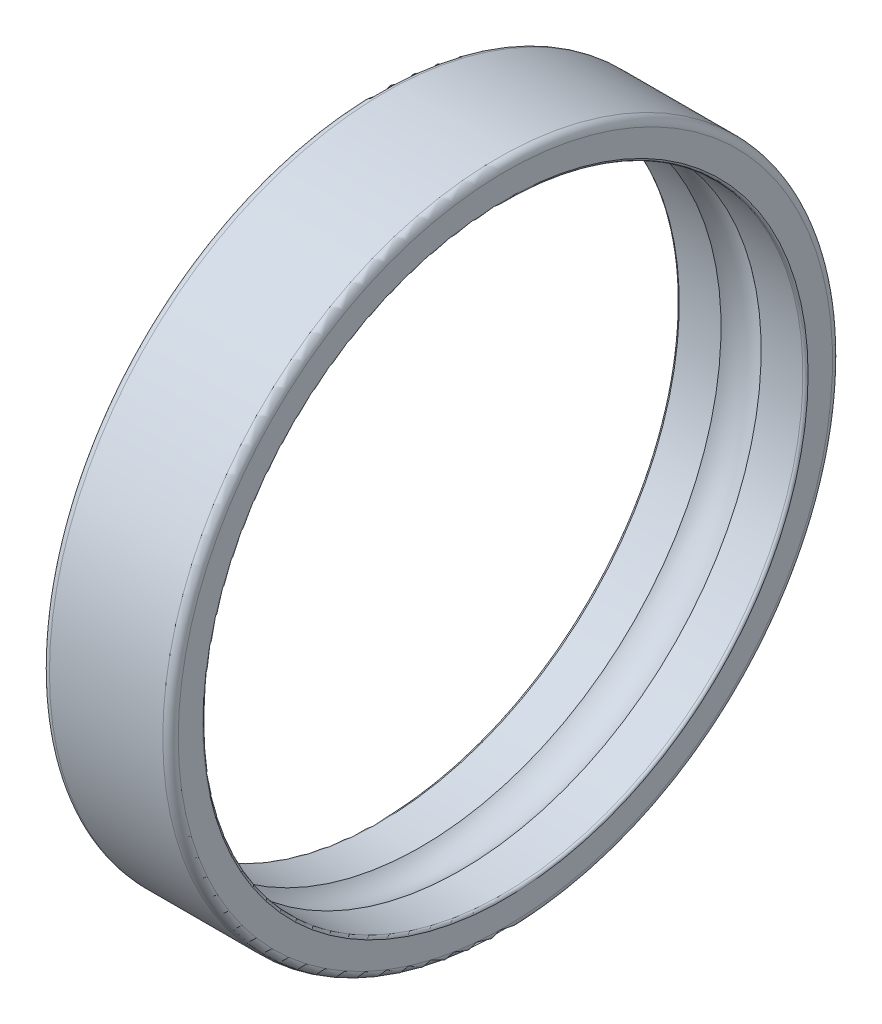
ISO-10303-21;
HEADER;
FILE_DESCRIPTION(('STEP AP214'),'2;1');
FILE_NAME('part.step','',(''),(''),'','','');
FILE_SCHEMA(('AUTOMOTIVE_DESIGN { 1 0 10303 214 1 1 1 1 }'));
ENDSEC;
DATA;
#1=APPLICATION_CONTEXT('core data for automotive mechanical design processes');
#2=APPLICATION_PROTOCOL_DEFINITION('international standard','automotive_design',2000,#1);
#3=PRODUCT_CONTEXT('',#1,'mechanical');
#4=PRODUCT('Part','Part','',(#3));
#5=PRODUCT_RELATED_PRODUCT_CATEGORY('part','',(#4));
#6=PRODUCT_DEFINITION_FORMATION('','',#4);
#7=PRODUCT_DEFINITION_CONTEXT('part definition',#1,'design');
#8=PRODUCT_DEFINITION('design','',#6,#7);
#9=PRODUCT_DEFINITION_SHAPE('','',#8);
#10=(LENGTH_UNIT() NAMED_UNIT(*) SI_UNIT(.MILLI.,.METRE.));
#11=(NAMED_UNIT(*) PLANE_ANGLE_UNIT() SI_UNIT($,.RADIAN.));
#12=(NAMED_UNIT(*) SI_UNIT($,.STERADIAN.) SOLID_ANGLE_UNIT());
#13=UNCERTAINTY_MEASURE_WITH_UNIT(LENGTH_MEASURE(1.E-05),#10,'distance_accuracy_value','');
#14=(GEOMETRIC_REPRESENTATION_CONTEXT(3) GLOBAL_UNCERTAINTY_ASSIGNED_CONTEXT((#13)) GLOBAL_UNIT_ASSIGNED_CONTEXT((#10,
#11,#12)) REPRESENTATION_CONTEXT('',''));
#15=CARTESIAN_POINT('',(0.,0.,0.));
#16=DIRECTION('',(0.,0.,1.));
#17=DIRECTION('',(1.,0.,0.));
#18=AXIS2_PLACEMENT_3D('',#15,#16,#17);
#19=CARTESIAN_POINT('',(0.,-12.9359195655334,-12.7));
#20=DIRECTION('',(-1.,0.,0.));
#21=DIRECTION('',(0.,0.,1.));
#22=AXIS2_PLACEMENT_3D('',#19,#20,#21);
#23=PLANE('',#22);
#24=CARTESIAN_POINT('',(0.,0.,0.));
#25=DIRECTION('',(-1.,0.,0.));
#26=DIRECTION('',(0.,0.,-1.));
#27=AXIS2_PLACEMENT_3D('',#24,#25,#26);
#28=CIRCLE('',#27,12.7);
#29=CARTESIAN_POINT('',(0.,0.,-12.7));
#30=VERTEX_POINT('',#29);
#31=EDGE_CURVE('E50',#30,#30,#28,.F.);
#32=ORIENTED_EDGE('',*,*,#31,.F.);
#33=EDGE_LOOP('',(#32));
#34=FACE_BOUND('',#33,.T.);
#35=CARTESIAN_POINT('',(0.,0.,0.));
#36=DIRECTION('',(1.,0.,0.));
#37=DIRECTION('',(0.,0.,1.));
#38=AXIS2_PLACEMENT_3D('',#35,#36,#37);
#39=CIRCLE('',#38,11.7499999999994);
#40=CARTESIAN_POINT('',(0.,0.,11.7499999999994));
#41=VERTEX_POINT('',#40);
#42=EDGE_CURVE('E47',#41,#41,#39,.T.);
#43=ORIENTED_EDGE('',*,*,#42,.T.);
#44=EDGE_LOOP('',(#43));
#45=FACE_BOUND('',#44,.T.);
#46=ADVANCED_FACE('F15',(#34,#45),#23,.T.);
#47=CARTESIAN_POINT('',(5.,-12.9359195434397,12.7));
#48=DIRECTION('',(1.,0.,0.));
#49=DIRECTION('',(0.,0.,-1.));
#50=AXIS2_PLACEMENT_3D('',#47,#48,#49);
#51=PLANE('',#50);
#52=CARTESIAN_POINT('',(5.,0.,0.));
#53=DIRECTION('',(1.,0.,0.));
#54=DIRECTION('',(0.,-1.16841773351946E-09,1.));
#55=AXIS2_PLACEMENT_3D('',#52,#53,#54);
#56=CIRCLE('',#55,12.7);
#57=CARTESIAN_POINT('',(5.,-1.48389052156972E-08,12.7));
#58=VERTEX_POINT('',#57);
#59=EDGE_CURVE('E44',#58,#58,#56,.T.);
#60=ORIENTED_EDGE('',*,*,#59,.T.);
#61=EDGE_LOOP('',(#60));
#62=FACE_BOUND('',#61,.T.);
#63=CARTESIAN_POINT('',(5.,0.,0.));
#64=DIRECTION('',(-1.,0.,0.));
#65=DIRECTION('',(0.,0.,-1.));
#66=AXIS2_PLACEMENT_3D('',#63,#64,#65);
#67=CIRCLE('',#66,11.7500000258519);
#68=CARTESIAN_POINT('',(5.,0.,-11.7500000258519));
#69=VERTEX_POINT('',#68);
#70=EDGE_CURVE('E41',#69,#69,#67,.F.);
#71=ORIENTED_EDGE('',*,*,#70,.F.);
#72=EDGE_LOOP('',(#71));
#73=FACE_BOUND('',#72,.T.);
#74=ADVANCED_FACE('F59',(#62,#73),#51,.T.);
#75=CARTESIAN_POINT('',(0.29999999999994,0.,0.));
#76=DIRECTION('',(1.,0.,0.));
#77=DIRECTION('',(0.,1.92328053823384E-10,1.));
#78=AXIS2_PLACEMENT_3D('',#75,#76,#77);
#79=TOROIDAL_SURFACE('',#78,12.7,0.299999999999939);
#80=ORIENTED_EDGE('',*,*,#31,.T.);
#81=EDGE_LOOP('',(#80));
#82=FACE_BOUND('',#81,.T.);
#83=CARTESIAN_POINT('',(0.29999999999994,0.,0.));
#84=DIRECTION('',(-1.,0.,0.));
#85=DIRECTION('',(0.,0.,-1.));
#86=AXIS2_PLACEMENT_3D('',#83,#84,#85);
#87=CIRCLE('',#86,12.9999999999999);
#88=CARTESIAN_POINT('',(0.29999999999994,0.,-12.9999999999999));
#89=VERTEX_POINT('',#88);
#90=EDGE_CURVE('E38',#89,#89,#87,.F.);
#91=ORIENTED_EDGE('',*,*,#90,.F.);
#92=EDGE_LOOP('',(#91));
#93=FACE_BOUND('',#92,.T.);
#94=ADVANCED_FACE('F54',(#82,#93),#79,.T.);
#95=CARTESIAN_POINT('',(0.099999999999411,0.,0.));
#96=DIRECTION('',(1.,0.,0.));
#97=DIRECTION('',(0.,0.,1.));
#98=AXIS2_PLACEMENT_3D('',#95,#96,#97);
#99=TOROIDAL_SURFACE('',#98,11.7499999999994,0.099999999999411);
#100=CARTESIAN_POINT('',(0.100000000000003,0.,0.));
#101=DIRECTION('',(1.,0.,0.));
#102=DIRECTION('',(0.,0.,1.));
#103=AXIS2_PLACEMENT_3D('',#100,#101,#102);
#104=CIRCLE('',#103,11.65);
#105=CARTESIAN_POINT('',(0.100000000000003,0.,11.65));
#106=VERTEX_POINT('',#105);
#107=EDGE_CURVE('E35',#106,#106,#104,.T.);
#108=ORIENTED_EDGE('',*,*,#107,.T.);
#109=EDGE_LOOP('',(#108));
#110=FACE_BOUND('',#109,.T.);
#111=ORIENTED_EDGE('',*,*,#42,.F.);
#112=EDGE_LOOP('',(#111));
#113=FACE_BOUND('',#112,.T.);
#114=ADVANCED_FACE('F63',(#110,#113),#99,.T.);
#115=CARTESIAN_POINT('',(50.,0.,0.));
#116=DIRECTION('',(1.,0.,0.));
#117=DIRECTION('',(0.,0.,1.));
#118=AXIS2_PLACEMENT_3D('',#115,#116,#117);
#119=CYLINDRICAL_SURFACE('',#118,11.65);
#120=CARTESIAN_POINT('',(1.7207117028981,0.,0.));
#121=DIRECTION('',(1.,0.,0.));
#122=DIRECTION('',(0.,0.,1.));
#123=AXIS2_PLACEMENT_3D('',#120,#121,#122);
#124=CIRCLE('',#123,11.65);
#125=CARTESIAN_POINT('',(1.7207117028981,0.,11.65));
#126=VERTEX_POINT('',#125);
#127=EDGE_CURVE('E30',#126,#126,#124,.T.);
#128=ORIENTED_EDGE('',*,*,#127,.T.);
#129=EDGE_LOOP('',(#128));
#130=FACE_BOUND('',#129,.T.);
#131=ORIENTED_EDGE('',*,*,#107,.F.);
#132=EDGE_LOOP('',(#131));
#133=FACE_BOUND('',#132,.T.);
#134=ADVANCED_FACE('F65',(#130,#133),#119,.F.);
#135=CARTESIAN_POINT('',(2.5,0.,0.));
#136=DIRECTION('',(1.,0.,0.));
#137=DIRECTION('',(0.,0.,1.));
#138=AXIS2_PLACEMENT_3D('',#135,#136,#137);
#139=TOROIDAL_SURFACE('',#138,10.75,1.19049999999997);
#140=ORIENTED_EDGE('',*,*,#127,.F.);
#141=EDGE_LOOP('',(#140));
#142=FACE_BOUND('',#141,.T.);
#143=CARTESIAN_POINT('',(3.27928829710189,0.,0.));
#144=DIRECTION('',(1.,0.,0.));
#145=DIRECTION('',(0.,-1.92343352016369E-10,1.));
#146=AXIS2_PLACEMENT_3D('',#143,#144,#145);
#147=CIRCLE('',#146,11.65);
#148=CARTESIAN_POINT('',(3.27928829710189,-2.2408000509907E-09,11.65));
#149=VERTEX_POINT('',#148);
#150=EDGE_CURVE('E26',#149,#149,#147,.T.);
#151=ORIENTED_EDGE('',*,*,#150,.T.);
#152=EDGE_LOOP('',(#151));
#153=FACE_BOUND('',#152,.T.);
#154=ADVANCED_FACE('F73',(#142,#153),#139,.F.);
#155=CARTESIAN_POINT('',(50.,0.,0.));
#156=DIRECTION('',(1.,0.,0.));
#157=DIRECTION('',(0.,0.,1.));
#158=AXIS2_PLACEMENT_3D('',#155,#156,#157);
#159=CYLINDRICAL_SURFACE('',#158,11.65);
#160=CARTESIAN_POINT('',(4.9,0.,0.));
#161=DIRECTION('',(1.,0.,0.));
#162=DIRECTION('',(0.,0.,1.));
#163=AXIS2_PLACEMENT_3D('',#160,#161,#162);
#164=CIRCLE('',#163,11.65);
#165=CARTESIAN_POINT('',(4.9,0.,11.65));
#166=VERTEX_POINT('',#165);
#167=EDGE_CURVE('E22',#166,#166,#164,.T.);
#168=ORIENTED_EDGE('',*,*,#167,.T.);
#169=EDGE_LOOP('',(#168));
#170=FACE_BOUND('',#169,.T.);
#171=ORIENTED_EDGE('',*,*,#150,.F.);
#172=EDGE_LOOP('',(#171));
#173=FACE_BOUND('',#172,.T.);
#174=ADVANCED_FACE('F81',(#170,#173),#159,.F.);
#175=CARTESIAN_POINT('',(4.90000000000067,0.,0.));
#176=DIRECTION('',(1.,0.,0.));
#177=DIRECTION('',(0.,1.16851962584527E-09,1.));
#178=AXIS2_PLACEMENT_3D('',#175,#176,#177);
#179=TOROIDAL_SURFACE('',#178,11.7499999999993,0.0999999999993333);
#180=ORIENTED_EDGE('',*,*,#70,.T.);
#181=EDGE_LOOP('',(#180));
#182=FACE_BOUND('',#181,.T.);
#183=ORIENTED_EDGE('',*,*,#167,.F.);
#184=EDGE_LOOP('',(#183));
#185=FACE_BOUND('',#184,.T.);
#186=ADVANCED_FACE('F85',(#182,#185),#179,.T.);
#187=CARTESIAN_POINT('',(4.70000000000012,0.,0.));
#188=DIRECTION('',(1.,0.,0.));
#189=DIRECTION('',(0.,0.,1.));
#190=AXIS2_PLACEMENT_3D('',#187,#188,#189);
#191=TOROIDAL_SURFACE('',#190,12.7000000000001,0.29999999999988);
#192=CARTESIAN_POINT('',(4.70000000000012,0.,0.));
#193=DIRECTION('',(1.,0.,0.));
#194=DIRECTION('',(0.,0.,1.));
#195=AXIS2_PLACEMENT_3D('',#192,#193,#194);
#196=CIRCLE('',#195,13.);
#197=CARTESIAN_POINT('',(4.70000000000012,0.,13.));
#198=VERTEX_POINT('',#197);
#199=EDGE_CURVE('E10',#198,#198,#196,.T.);
#200=ORIENTED_EDGE('',*,*,#199,.T.);
#201=EDGE_LOOP('',(#200));
#202=FACE_BOUND('',#201,.T.);
#203=ORIENTED_EDGE('',*,*,#59,.F.);
#204=EDGE_LOOP('',(#203));
#205=FACE_BOUND('',#204,.T.);
#206=ADVANCED_FACE('F87',(#202,#205),#191,.T.);
#207=CARTESIAN_POINT('',(50.,0.,0.));
#208=DIRECTION('',(1.,0.,0.));
#209=DIRECTION('',(0.,1.92328053823384E-10,1.));
#210=AXIS2_PLACEMENT_3D('',#207,#208,#209);
#211=CYLINDRICAL_SURFACE('',#210,13.);
#212=ORIENTED_EDGE('',*,*,#90,.T.);
#213=EDGE_LOOP('',(#212));
#214=FACE_BOUND('',#213,.T.);
#215=ORIENTED_EDGE('',*,*,#199,.F.);
#216=EDGE_LOOP('',(#215));
#217=FACE_BOUND('',#216,.T.);
#218=ADVANCED_FACE('F17',(#214,#217),#211,.T.);
#219=CLOSED_SHELL('',(#46,#74,#94,#114,#134,#154,#174,#186,#206,#218));
#220=MANIFOLD_SOLID_BREP('B1',#219);
#221=ADVANCED_BREP_SHAPE_REPRESENTATION('',(#18,#220),#14);
#222=SHAPE_DEFINITION_REPRESENTATION(#9,#221);
ENDSEC;
END-ISO-10303-21;
